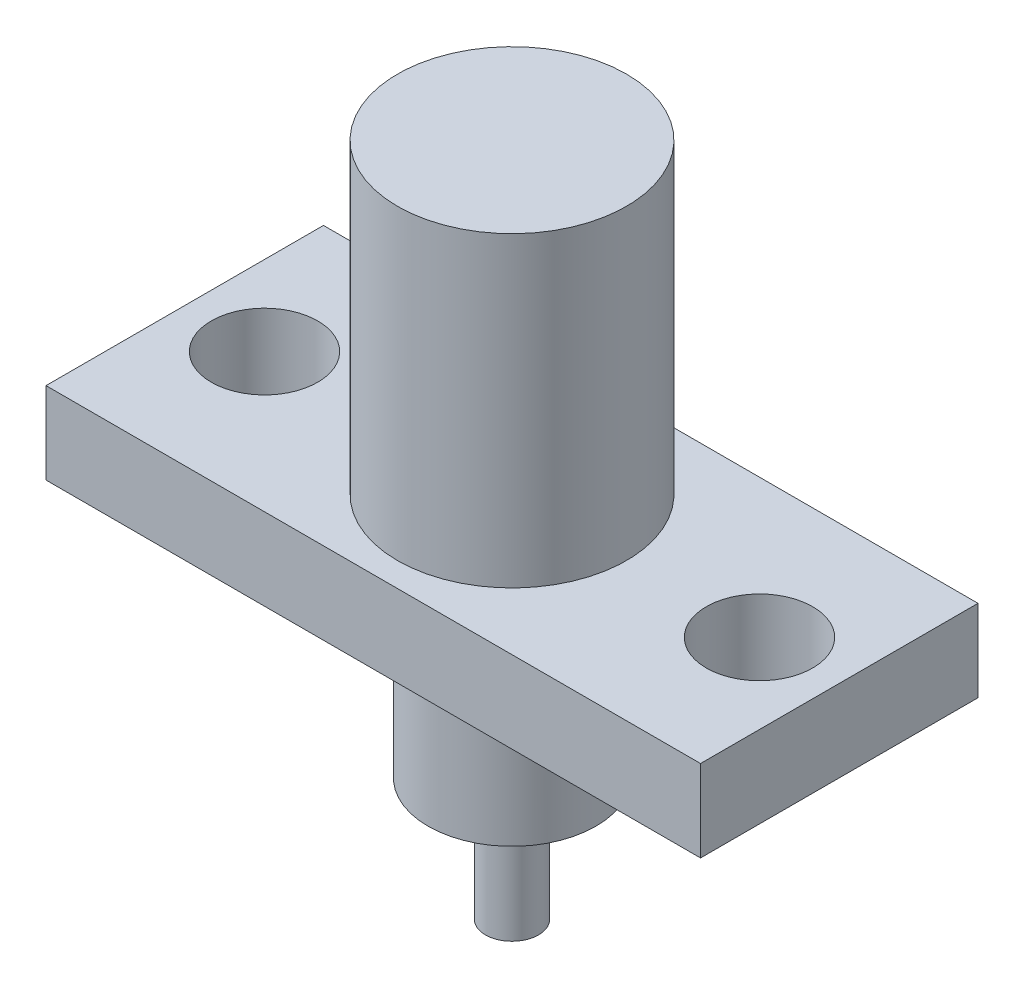
ISO-10303-21;
HEADER;
FILE_DESCRIPTION(('STEP AP214'),'2;1');
FILE_NAME('part.step','',(''),(''),'','','');
FILE_SCHEMA(('AUTOMOTIVE_DESIGN { 1 0 10303 214 1 1 1 1 }'));
ENDSEC;
DATA;
#1=APPLICATION_CONTEXT('core data for automotive mechanical design processes');
#2=APPLICATION_PROTOCOL_DEFINITION('international standard','automotive_design',2000,#1);
#3=PRODUCT_CONTEXT('',#1,'mechanical');
#4=PRODUCT('Part','Part','',(#3));
#5=PRODUCT_RELATED_PRODUCT_CATEGORY('part','',(#4));
#6=PRODUCT_DEFINITION_FORMATION('','',#4);
#7=PRODUCT_DEFINITION_CONTEXT('part definition',#1,'design');
#8=PRODUCT_DEFINITION('design','',#6,#7);
#9=PRODUCT_DEFINITION_SHAPE('','',#8);
#10=(LENGTH_UNIT() NAMED_UNIT(*) SI_UNIT(.MILLI.,.METRE.));
#11=(NAMED_UNIT(*) PLANE_ANGLE_UNIT() SI_UNIT($,.RADIAN.));
#12=(NAMED_UNIT(*) SI_UNIT($,.STERADIAN.) SOLID_ANGLE_UNIT());
#13=UNCERTAINTY_MEASURE_WITH_UNIT(LENGTH_MEASURE(1.E-05),#10,'distance_accuracy_value','');
#14=(GEOMETRIC_REPRESENTATION_CONTEXT(3) GLOBAL_UNCERTAINTY_ASSIGNED_CONTEXT((#13)) GLOBAL_UNIT_ASSIGNED_CONTEXT((#10,
#11,#12)) REPRESENTATION_CONTEXT('',''));
#15=CARTESIAN_POINT('',(0.,0.,0.));
#16=DIRECTION('',(0.,0.,1.));
#17=DIRECTION('',(1.,0.,0.));
#18=AXIS2_PLACEMENT_3D('',#15,#16,#17);
#19=CARTESIAN_POINT('',(0.,2.,3.39130434782607));
#20=DIRECTION('',(0.,0.,-1.));
#21=DIRECTION('',(-1.,0.,0.));
#22=AXIS2_PLACEMENT_3D('',#19,#20,#21);
#23=PLANE('',#22);
#24=DIRECTION('',(1.,0.,0.));
#25=VECTOR('',#24,1.);
#26=CARTESIAN_POINT('',(0.,0.,3.39130434782607));
#27=LINE('',#26,#25);
#28=CARTESIAN_POINT('',(-8.,0.,3.39130434782607));
#29=VERTEX_POINT('',#28);
#30=CARTESIAN_POINT('',(8.,0.,3.39130434782607));
#31=VERTEX_POINT('',#30);
#32=EDGE_CURVE('E122',#29,#31,#27,.T.);
#33=ORIENTED_EDGE('',*,*,#32,.T.);
#34=DIRECTION('',(0.,-1.,0.));
#35=VECTOR('',#34,1.);
#36=CARTESIAN_POINT('',(8.,2.,3.39130434782607));
#37=LINE('',#36,#35);
#38=CARTESIAN_POINT('',(8.,2.,3.39130434782607));
#39=VERTEX_POINT('',#38);
#40=EDGE_CURVE('E103',#39,#31,#37,.T.);
#41=ORIENTED_EDGE('',*,*,#40,.F.);
#42=DIRECTION('',(1.,0.,0.));
#43=VECTOR('',#42,1.);
#44=CARTESIAN_POINT('',(0.,2.,3.39130434782607));
#45=LINE('',#44,#43);
#46=CARTESIAN_POINT('',(-8.,2.,3.39130434782607));
#47=VERTEX_POINT('',#46);
#48=EDGE_CURVE('E92',#47,#39,#45,.T.);
#49=ORIENTED_EDGE('',*,*,#48,.F.);
#50=DIRECTION('',(0.,-1.,0.));
#51=VECTOR('',#50,1.);
#52=CARTESIAN_POINT('',(-8.,2.,3.39130434782607));
#53=LINE('',#52,#51);
#54=EDGE_CURVE('E58',#47,#29,#53,.T.);
#55=ORIENTED_EDGE('',*,*,#54,.T.);
#56=EDGE_LOOP('',(#33,#41,#49,#55));
#57=FACE_BOUND('',#56,.T.);
#58=ADVANCED_FACE('F39',(#57),#23,.F.);
#59=CARTESIAN_POINT('',(8.,2.,0.));
#60=DIRECTION('',(-1.,0.,0.));
#61=DIRECTION('',(0.,0.,1.));
#62=AXIS2_PLACEMENT_3D('',#59,#60,#61);
#63=PLANE('',#62);
#64=DIRECTION('',(0.,0.,-1.));
#65=VECTOR('',#64,1.);
#66=CARTESIAN_POINT('',(8.,0.,0.));
#67=LINE('',#66,#65);
#68=CARTESIAN_POINT('',(8.,0.,-3.39130434782607));
#69=VERTEX_POINT('',#68);
#70=EDGE_CURVE('E99',#31,#69,#67,.T.);
#71=ORIENTED_EDGE('',*,*,#70,.T.);
#72=DIRECTION('',(0.,-1.,0.));
#73=VECTOR('',#72,1.);
#74=CARTESIAN_POINT('',(8.,2.,-3.39130434782607));
#75=LINE('',#74,#73);
#76=CARTESIAN_POINT('',(8.,2.,-3.39130434782607));
#77=VERTEX_POINT('',#76);
#78=EDGE_CURVE('E97',#77,#69,#75,.T.);
#79=ORIENTED_EDGE('',*,*,#78,.F.);
#80=DIRECTION('',(0.,0.,-1.));
#81=VECTOR('',#80,1.);
#82=CARTESIAN_POINT('',(8.,2.,0.));
#83=LINE('',#82,#81);
#84=EDGE_CURVE('E84',#39,#77,#83,.T.);
#85=ORIENTED_EDGE('',*,*,#84,.F.);
#86=ORIENTED_EDGE('',*,*,#40,.T.);
#87=EDGE_LOOP('',(#71,#79,#85,#86));
#88=FACE_BOUND('',#87,.T.);
#89=ADVANCED_FACE('F98',(#88),#63,.F.);
#90=CARTESIAN_POINT('',(0.,2.,-3.39130434782607));
#91=DIRECTION('',(0.,0.,-1.));
#92=DIRECTION('',(-1.,0.,0.));
#93=AXIS2_PLACEMENT_3D('',#90,#91,#92);
#94=PLANE('',#93);
#95=DIRECTION('',(1.,0.,0.));
#96=VECTOR('',#95,1.);
#97=CARTESIAN_POINT('',(0.,0.,-3.39130434782607));
#98=LINE('',#97,#96);
#99=CARTESIAN_POINT('',(-8.,0.,-3.39130434782607));
#100=VERTEX_POINT('',#99);
#101=EDGE_CURVE('E127',#100,#69,#98,.T.);
#102=ORIENTED_EDGE('',*,*,#101,.F.);
#103=DIRECTION('',(0.,-1.,0.));
#104=VECTOR('',#103,1.);
#105=CARTESIAN_POINT('',(-8.,2.,-3.39130434782607));
#106=LINE('',#105,#104);
#107=CARTESIAN_POINT('',(-8.,2.,-3.39130434782607));
#108=VERTEX_POINT('',#107);
#109=EDGE_CURVE('E72',#108,#100,#106,.T.);
#110=ORIENTED_EDGE('',*,*,#109,.F.);
#111=DIRECTION('',(1.,0.,0.));
#112=VECTOR('',#111,1.);
#113=CARTESIAN_POINT('',(0.,2.,-3.39130434782607));
#114=LINE('',#113,#112);
#115=EDGE_CURVE('E91',#108,#77,#114,.T.);
#116=ORIENTED_EDGE('',*,*,#115,.T.);
#117=ORIENTED_EDGE('',*,*,#78,.T.);
#118=EDGE_LOOP('',(#102,#110,#116,#117));
#119=FACE_BOUND('',#118,.T.);
#120=ADVANCED_FACE('F105',(#119),#94,.T.);
#121=CARTESIAN_POINT('',(-6.05,2.,0.));
#122=DIRECTION('',(0.,-1.,0.));
#123=DIRECTION('',(0.,0.,-1.));
#124=AXIS2_PLACEMENT_3D('',#121,#122,#123);
#125=CYLINDRICAL_SURFACE('',#124,1.3);
#126=CARTESIAN_POINT('',(-6.05,2.,0.));
#127=DIRECTION('',(0.,1.,0.));
#128=DIRECTION('',(0.,0.,1.));
#129=AXIS2_PLACEMENT_3D('',#126,#127,#128);
#130=CIRCLE('',#129,1.3);
#131=CARTESIAN_POINT('',(-6.05,2.,1.3));
#132=VERTEX_POINT('',#131);
#133=EDGE_CURVE('E180',#132,#132,#130,.T.);
#134=ORIENTED_EDGE('',*,*,#133,.T.);
#135=EDGE_LOOP('',(#134));
#136=FACE_BOUND('',#135,.T.);
#137=CARTESIAN_POINT('',(-6.05,0.,0.));
#138=DIRECTION('',(0.,1.,0.));
#139=DIRECTION('',(0.,0.,1.));
#140=AXIS2_PLACEMENT_3D('',#137,#138,#139);
#141=CIRCLE('',#140,1.3);
#142=CARTESIAN_POINT('',(-6.05,0.,1.3));
#143=VERTEX_POINT('',#142);
#144=EDGE_CURVE('E117',#143,#143,#141,.T.);
#145=ORIENTED_EDGE('',*,*,#144,.F.);
#146=EDGE_LOOP('',(#145));
#147=FACE_BOUND('',#146,.T.);
#148=ADVANCED_FACE('F163',(#136,#147),#125,.F.);
#149=CARTESIAN_POINT('',(6.05,2.,0.));
#150=DIRECTION('',(0.,-1.,0.));
#151=DIRECTION('',(0.,0.,-1.));
#152=AXIS2_PLACEMENT_3D('',#149,#150,#151);
#153=CYLINDRICAL_SURFACE('',#152,1.3);
#154=CARTESIAN_POINT('',(6.05,2.,0.));
#155=DIRECTION('',(0.,1.,0.));
#156=DIRECTION('',(0.,0.,1.));
#157=AXIS2_PLACEMENT_3D('',#154,#155,#156);
#158=CIRCLE('',#157,1.3);
#159=CARTESIAN_POINT('',(6.05,2.,1.3));
#160=VERTEX_POINT('',#159);
#161=EDGE_CURVE('E134',#160,#160,#158,.T.);
#162=ORIENTED_EDGE('',*,*,#161,.T.);
#163=EDGE_LOOP('',(#162));
#164=FACE_BOUND('',#163,.T.);
#165=CARTESIAN_POINT('',(6.05,0.,0.));
#166=DIRECTION('',(0.,1.,0.));
#167=DIRECTION('',(0.,0.,1.));
#168=AXIS2_PLACEMENT_3D('',#165,#166,#167);
#169=CIRCLE('',#168,1.3);
#170=CARTESIAN_POINT('',(6.05,0.,1.3));
#171=VERTEX_POINT('',#170);
#172=EDGE_CURVE('E113',#171,#171,#169,.T.);
#173=ORIENTED_EDGE('',*,*,#172,.F.);
#174=EDGE_LOOP('',(#173));
#175=FACE_BOUND('',#174,.T.);
#176=ADVANCED_FACE('F41',(#164,#175),#153,.F.);
#177=CARTESIAN_POINT('',(-8.,2.,0.));
#178=DIRECTION('',(-1.,0.,0.));
#179=DIRECTION('',(0.,0.,1.));
#180=AXIS2_PLACEMENT_3D('',#177,#178,#179);
#181=PLANE('',#180);
#182=DIRECTION('',(0.,0.,-1.));
#183=VECTOR('',#182,1.);
#184=CARTESIAN_POINT('',(-8.,0.,0.));
#185=LINE('',#184,#183);
#186=EDGE_CURVE('E130',#29,#100,#185,.T.);
#187=ORIENTED_EDGE('',*,*,#186,.F.);
#188=ORIENTED_EDGE('',*,*,#54,.F.);
#189=DIRECTION('',(0.,0.,-1.));
#190=VECTOR('',#189,1.);
#191=CARTESIAN_POINT('',(-8.,2.,0.));
#192=LINE('',#191,#190);
#193=EDGE_CURVE('E107',#47,#108,#192,.T.);
#194=ORIENTED_EDGE('',*,*,#193,.T.);
#195=ORIENTED_EDGE('',*,*,#109,.T.);
#196=EDGE_LOOP('',(#187,#188,#194,#195));
#197=FACE_BOUND('',#196,.T.);
#198=ADVANCED_FACE('F154',(#197),#181,.T.);
#199=CARTESIAN_POINT('',(0.,2.,0.));
#200=DIRECTION('',(0.,1.,0.));
#201=DIRECTION('',(0.,0.,1.));
#202=AXIS2_PLACEMENT_3D('',#199,#200,#201);
#203=PLANE('',#202);
#204=CARTESIAN_POINT('',(0.,2.,0.));
#205=DIRECTION('',(0.,1.,0.));
#206=DIRECTION('',(0.,0.,1.));
#207=AXIS2_PLACEMENT_3D('',#204,#205,#206);
#208=CIRCLE('',#207,2.8);
#209=CARTESIAN_POINT('',(0.,2.,2.8));
#210=VERTEX_POINT('',#209);
#211=EDGE_CURVE('E189',#210,#210,#208,.T.);
#212=ORIENTED_EDGE('',*,*,#211,.F.);
#213=EDGE_LOOP('',(#212));
#214=FACE_BOUND('',#213,.T.);
#215=ORIENTED_EDGE('',*,*,#161,.F.);
#216=EDGE_LOOP('',(#215));
#217=FACE_BOUND('',#216,.T.);
#218=ORIENTED_EDGE('',*,*,#133,.F.);
#219=EDGE_LOOP('',(#218));
#220=FACE_BOUND('',#219,.T.);
#221=ORIENTED_EDGE('',*,*,#48,.T.);
#222=ORIENTED_EDGE('',*,*,#84,.T.);
#223=ORIENTED_EDGE('',*,*,#115,.F.);
#224=ORIENTED_EDGE('',*,*,#193,.F.);
#225=EDGE_LOOP('',(#221,#222,#223,#224));
#226=FACE_BOUND('',#225,.T.);
#227=ADVANCED_FACE('F88',(#214,#217,#220,#226),#203,.T.);
#228=CARTESIAN_POINT('',(0.,0.,0.));
#229=DIRECTION('',(0.,1.,0.));
#230=DIRECTION('',(0.,0.,1.));
#231=AXIS2_PLACEMENT_3D('',#228,#229,#230);
#232=PLANE('',#231);
#233=CARTESIAN_POINT('',(0.,0.,0.));
#234=DIRECTION('',(0.,1.,0.));
#235=DIRECTION('',(0.,0.,1.));
#236=AXIS2_PLACEMENT_3D('',#233,#234,#235);
#237=CIRCLE('',#236,2.05);
#238=CARTESIAN_POINT('',(0.,0.,2.05));
#239=VERTEX_POINT('',#238);
#240=EDGE_CURVE('E43',#239,#239,#237,.F.);
#241=ORIENTED_EDGE('',*,*,#240,.F.);
#242=EDGE_LOOP('',(#241));
#243=FACE_BOUND('',#242,.T.);
#244=ORIENTED_EDGE('',*,*,#172,.T.);
#245=EDGE_LOOP('',(#244));
#246=FACE_BOUND('',#245,.T.);
#247=ORIENTED_EDGE('',*,*,#144,.T.);
#248=EDGE_LOOP('',(#247));
#249=FACE_BOUND('',#248,.T.);
#250=ORIENTED_EDGE('',*,*,#32,.F.);
#251=ORIENTED_EDGE('',*,*,#186,.T.);
#252=ORIENTED_EDGE('',*,*,#101,.T.);
#253=ORIENTED_EDGE('',*,*,#70,.F.);
#254=EDGE_LOOP('',(#250,#251,#252,#253));
#255=FACE_BOUND('',#254,.T.);
#256=ADVANCED_FACE('F145',(#243,#246,#249,#255),#232,.F.);
#257=CARTESIAN_POINT('',(0.,9.5,0.));
#258=DIRECTION('',(0.,-1.,0.));
#259=DIRECTION('',(0.,0.,-1.));
#260=AXIS2_PLACEMENT_3D('',#257,#258,#259);
#261=CYLINDRICAL_SURFACE('',#260,2.8);
#262=CARTESIAN_POINT('',(0.,9.5,0.));
#263=DIRECTION('',(0.,1.,0.));
#264=DIRECTION('',(0.,0.,1.));
#265=AXIS2_PLACEMENT_3D('',#262,#263,#264);
#266=CIRCLE('',#265,2.8);
#267=CARTESIAN_POINT('',(0.,9.5,2.8));
#268=VERTEX_POINT('',#267);
#269=EDGE_CURVE('E118',#268,#268,#266,.T.);
#270=ORIENTED_EDGE('',*,*,#269,.F.);
#271=EDGE_LOOP('',(#270));
#272=FACE_BOUND('',#271,.T.);
#273=ORIENTED_EDGE('',*,*,#211,.T.);
#274=EDGE_LOOP('',(#273));
#275=FACE_BOUND('',#274,.T.);
#276=ADVANCED_FACE('F148',(#272,#275),#261,.T.);
#277=CARTESIAN_POINT('',(0.,9.5,0.));
#278=DIRECTION('',(0.,1.,0.));
#279=DIRECTION('',(0.,0.,1.));
#280=AXIS2_PLACEMENT_3D('',#277,#278,#279);
#281=PLANE('',#280);
#282=ORIENTED_EDGE('',*,*,#269,.T.);
#283=EDGE_LOOP('',(#282));
#284=FACE_BOUND('',#283,.T.);
#285=ADVANCED_FACE('F220',(#284),#281,.T.);
#286=CARTESIAN_POINT('',(0.,-4.,0.));
#287=DIRECTION('',(0.,1.,0.));
#288=DIRECTION('',(0.,0.,1.));
#289=AXIS2_PLACEMENT_3D('',#286,#287,#288);
#290=CYLINDRICAL_SURFACE('',#289,2.05);
#291=CARTESIAN_POINT('',(0.,-4.,0.));
#292=DIRECTION('',(0.,-1.,0.));
#293=DIRECTION('',(0.,0.,-1.));
#294=AXIS2_PLACEMENT_3D('',#291,#292,#293);
#295=CIRCLE('',#294,2.05);
#296=CARTESIAN_POINT('',(0.,-4.,-2.05));
#297=VERTEX_POINT('',#296);
#298=EDGE_CURVE('E193',#297,#297,#295,.T.);
#299=ORIENTED_EDGE('',*,*,#298,.F.);
#300=EDGE_LOOP('',(#299));
#301=FACE_BOUND('',#300,.T.);
#302=ORIENTED_EDGE('',*,*,#240,.T.);
#303=EDGE_LOOP('',(#302));
#304=FACE_BOUND('',#303,.T.);
#305=ADVANCED_FACE('F143',(#301,#304),#290,.T.);
#306=CARTESIAN_POINT('',(0.,-4.,0.));
#307=DIRECTION('',(0.,-1.,0.));
#308=DIRECTION('',(0.,0.,-1.));
#309=AXIS2_PLACEMENT_3D('',#306,#307,#308);
#310=PLANE('',#309);
#311=CARTESIAN_POINT('',(0.,-4.,0.));
#312=DIRECTION('',(0.,-1.,0.));
#313=DIRECTION('',(0.,0.,-1.));
#314=AXIS2_PLACEMENT_3D('',#311,#312,#313);
#315=CIRCLE('',#314,0.65);
#316=CARTESIAN_POINT('',(0.,-4.,-0.65));
#317=VERTEX_POINT('',#316);
#318=EDGE_CURVE('E11',#317,#317,#315,.T.);
#319=ORIENTED_EDGE('',*,*,#318,.F.);
#320=EDGE_LOOP('',(#319));
#321=FACE_BOUND('',#320,.T.);
#322=ORIENTED_EDGE('',*,*,#298,.T.);
#323=EDGE_LOOP('',(#322));
#324=FACE_BOUND('',#323,.T.);
#325=ADVANCED_FACE('F210',(#321,#324),#310,.T.);
#326=CARTESIAN_POINT('',(0.,-7.,0.));
#327=DIRECTION('',(0.,1.,0.));
#328=DIRECTION('',(0.,0.,1.));
#329=AXIS2_PLACEMENT_3D('',#326,#327,#328);
#330=CYLINDRICAL_SURFACE('',#329,0.65);
#331=CARTESIAN_POINT('',(0.,-7.,0.));
#332=DIRECTION('',(0.,-1.,0.));
#333=DIRECTION('',(0.,0.,-1.));
#334=AXIS2_PLACEMENT_3D('',#331,#332,#333);
#335=CIRCLE('',#334,0.65);
#336=CARTESIAN_POINT('',(0.,-7.,-0.65));
#337=VERTEX_POINT('',#336);
#338=EDGE_CURVE('E199',#337,#337,#335,.T.);
#339=ORIENTED_EDGE('',*,*,#338,.F.);
#340=EDGE_LOOP('',(#339));
#341=FACE_BOUND('',#340,.T.);
#342=ORIENTED_EDGE('',*,*,#318,.T.);
#343=EDGE_LOOP('',(#342));
#344=FACE_BOUND('',#343,.T.);
#345=ADVANCED_FACE('F207',(#341,#344),#330,.T.);
#346=CARTESIAN_POINT('',(0.,-7.,0.));
#347=DIRECTION('',(0.,-1.,0.));
#348=DIRECTION('',(0.,0.,-1.));
#349=AXIS2_PLACEMENT_3D('',#346,#347,#348);
#350=PLANE('',#349);
#351=ORIENTED_EDGE('',*,*,#338,.T.);
#352=EDGE_LOOP('',(#351));
#353=FACE_BOUND('',#352,.T.);
#354=ADVANCED_FACE('F205',(#353),#350,.T.);
#355=CLOSED_SHELL('',(#58,#89,#120,#148,#176,#198,#227,#256,#276,#285,#305,#325,#345,#354));
#356=MANIFOLD_SOLID_BREP('B2',#355);
#357=ADVANCED_BREP_SHAPE_REPRESENTATION('',(#18,#356),#14);
#358=SHAPE_DEFINITION_REPRESENTATION(#9,#357);
ENDSEC;
END-ISO-10303-21;
